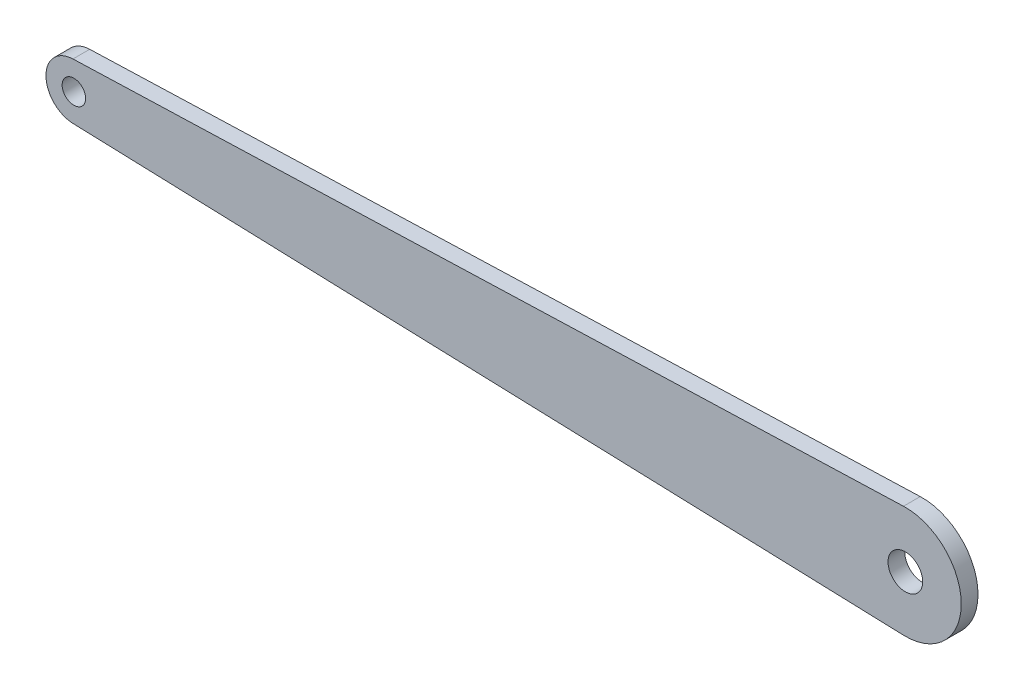
ISO-10303-21;
HEADER;
FILE_DESCRIPTION(('STEP AP214'),'2;1');
FILE_NAME('part.step','',(''),(''),'','','');
FILE_SCHEMA(('AUTOMOTIVE_DESIGN { 1 0 10303 214 1 1 1 1 }'));
ENDSEC;
DATA;
#1=APPLICATION_CONTEXT('core data for automotive mechanical design processes');
#2=APPLICATION_PROTOCOL_DEFINITION('international standard','automotive_design',2000,#1);
#3=PRODUCT_CONTEXT('',#1,'mechanical');
#4=PRODUCT('Part','Part','',(#3));
#5=PRODUCT_RELATED_PRODUCT_CATEGORY('part','',(#4));
#6=PRODUCT_DEFINITION_FORMATION('','',#4);
#7=PRODUCT_DEFINITION_CONTEXT('part definition',#1,'design');
#8=PRODUCT_DEFINITION('design','',#6,#7);
#9=PRODUCT_DEFINITION_SHAPE('','',#8);
#10=(LENGTH_UNIT() NAMED_UNIT(*) SI_UNIT(.MILLI.,.METRE.));
#11=(NAMED_UNIT(*) PLANE_ANGLE_UNIT() SI_UNIT($,.RADIAN.));
#12=(NAMED_UNIT(*) SI_UNIT($,.STERADIAN.) SOLID_ANGLE_UNIT());
#13=UNCERTAINTY_MEASURE_WITH_UNIT(LENGTH_MEASURE(1.E-05),#10,'distance_accuracy_value','');
#14=(GEOMETRIC_REPRESENTATION_CONTEXT(3) GLOBAL_UNCERTAINTY_ASSIGNED_CONTEXT((#13)) GLOBAL_UNIT_ASSIGNED_CONTEXT((#10,
#11,#12)) REPRESENTATION_CONTEXT('',''));
#15=CARTESIAN_POINT('',(0.,0.,0.));
#16=DIRECTION('',(0.,0.,1.));
#17=DIRECTION('',(1.,0.,0.));
#18=AXIS2_PLACEMENT_3D('',#15,#16,#17);
#19=CARTESIAN_POINT('',(-231.057682163255,117.796222956078,-62.1117165948132));
#20=DIRECTION('',(0.,0.,-1.));
#21=DIRECTION('',(-1.,0.,0.));
#22=AXIS2_PLACEMENT_3D('',#19,#20,#21);
#23=PLANE('',#22);
#24=CARTESIAN_POINT('',(-82.2376821632552,117.796222956078,-62.1117165948132));
#25=DIRECTION('',(0.,0.,-1.));
#26=DIRECTION('',(-1.,0.,0.));
#27=AXIS2_PLACEMENT_3D('',#24,#25,#26);
#28=CIRCLE('',#27,3.1);
#29=CARTESIAN_POINT('',(-85.3376821632552,117.796222956078,-62.1117165948132));
#30=VERTEX_POINT('',#29);
#31=EDGE_CURVE('E108',#30,#30,#28,.T.);
#32=ORIENTED_EDGE('',*,*,#31,.F.);
#33=EDGE_LOOP('',(#32));
#34=FACE_BOUND('',#33,.T.);
#35=CARTESIAN_POINT('',(-231.057682163255,117.796222956078,-62.1117165948132));
#36=DIRECTION('',(0.,0.,-1.));
#37=DIRECTION('',(-1.,0.,0.));
#38=AXIS2_PLACEMENT_3D('',#35,#36,#37);
#39=CIRCLE('',#38,5.00000000000001);
#40=CARTESIAN_POINT('',(-231.225670336888,112.799045755546,-62.1117165948132));
#41=VERTEX_POINT('',#40);
#42=CARTESIAN_POINT('',(-231.225670336888,122.793400156611,-62.1117165948132));
#43=VERTEX_POINT('',#42);
#44=EDGE_CURVE('E93',#41,#43,#39,.T.);
#45=ORIENTED_EDGE('',*,*,#44,.T.);
#46=DIRECTION('',(0.999435440106455,0.0335976347265153,0.));
#47=VECTOR('',#46,1.);
#48=CARTESIAN_POINT('',(-231.225670336888,122.793400156611,-62.1117165948132));
#49=LINE('',#48,#47);
#50=CARTESIAN_POINT('',(-82.5736585105203,127.790577357143,-62.1117165948132));
#51=VERTEX_POINT('',#50);
#52=EDGE_CURVE('E88',#43,#51,#49,.T.);
#53=ORIENTED_EDGE('',*,*,#52,.T.);
#54=CARTESIAN_POINT('',(-82.2376821632552,117.796222956078,-62.1117165948132));
#55=DIRECTION('',(0.,0.,-1.));
#56=DIRECTION('',(-1.,0.,0.));
#57=AXIS2_PLACEMENT_3D('',#54,#55,#56);
#58=CIRCLE('',#57,10.);
#59=CARTESIAN_POINT('',(-82.5736585105203,107.801868555014,-62.1117165948132));
#60=VERTEX_POINT('',#59);
#61=EDGE_CURVE('E91',#51,#60,#58,.T.);
#62=ORIENTED_EDGE('',*,*,#61,.T.);
#63=DIRECTION('',(-0.999435440106455,0.0335976347265153,0.));
#64=VECTOR('',#63,1.);
#65=CARTESIAN_POINT('',(-82.5736585105203,107.801868555014,-62.1117165948132));
#66=LINE('',#65,#64);
#67=EDGE_CURVE('E58',#60,#41,#66,.T.);
#68=ORIENTED_EDGE('',*,*,#67,.T.);
#69=EDGE_LOOP('',(#45,#53,#62,#68));
#70=FACE_BOUND('',#69,.T.);
#71=CARTESIAN_POINT('',(-231.057682163255,117.796222956078,-62.1117165948132));
#72=DIRECTION('',(0.,0.,-1.));
#73=DIRECTION('',(-1.,0.,0.));
#74=AXIS2_PLACEMENT_3D('',#71,#72,#73);
#75=CIRCLE('',#74,2.09999999999999);
#76=CARTESIAN_POINT('',(-233.157682163255,117.796222956078,-62.1117165948132));
#77=VERTEX_POINT('',#76);
#78=EDGE_CURVE('E123',#77,#77,#75,.T.);
#79=ORIENTED_EDGE('',*,*,#78,.F.);
#80=EDGE_LOOP('',(#79));
#81=FACE_BOUND('',#80,.T.);
#82=ADVANCED_FACE('F41',(#34,#70,#81),#23,.T.);
#83=CARTESIAN_POINT('',(-231.057682163255,117.796222956078,-59.1117165948132));
#84=DIRECTION('',(0.,0.,-1.));
#85=DIRECTION('',(-1.,0.,0.));
#86=AXIS2_PLACEMENT_3D('',#83,#84,#85);
#87=PLANE('',#86);
#88=CARTESIAN_POINT('',(-231.057682163255,117.796222956078,-59.1117165948132));
#89=DIRECTION('',(0.,0.,-1.));
#90=DIRECTION('',(-1.,0.,0.));
#91=AXIS2_PLACEMENT_3D('',#88,#89,#90);
#92=CIRCLE('',#91,5.00000000000001);
#93=CARTESIAN_POINT('',(-231.225670336888,112.799045755546,-59.1117165948132));
#94=VERTEX_POINT('',#93);
#95=CARTESIAN_POINT('',(-231.225670336888,122.793400156611,-59.1117165948132));
#96=VERTEX_POINT('',#95);
#97=EDGE_CURVE('E105',#94,#96,#92,.T.);
#98=ORIENTED_EDGE('',*,*,#97,.F.);
#99=DIRECTION('',(-0.999435440106455,0.0335976347265153,0.));
#100=VECTOR('',#99,1.);
#101=CARTESIAN_POINT('',(-82.5736585105203,107.801868555014,-59.1117165948132));
#102=LINE('',#101,#100);
#103=CARTESIAN_POINT('',(-82.5736585105203,107.801868555014,-59.1117165948132));
#104=VERTEX_POINT('',#103);
#105=EDGE_CURVE('E81',#104,#94,#102,.T.);
#106=ORIENTED_EDGE('',*,*,#105,.F.);
#107=CARTESIAN_POINT('',(-82.2376821632552,117.796222956078,-59.1117165948132));
#108=DIRECTION('',(0.,0.,-1.));
#109=DIRECTION('',(-1.,0.,0.));
#110=AXIS2_PLACEMENT_3D('',#107,#108,#109);
#111=CIRCLE('',#110,10.);
#112=CARTESIAN_POINT('',(-82.5736585105203,127.790577357143,-59.1117165948132));
#113=VERTEX_POINT('',#112);
#114=EDGE_CURVE('E75',#113,#104,#111,.T.);
#115=ORIENTED_EDGE('',*,*,#114,.F.);
#116=DIRECTION('',(0.999435440106455,0.0335976347265153,0.));
#117=VECTOR('',#116,1.);
#118=CARTESIAN_POINT('',(-231.225670336888,122.793400156611,-59.1117165948132));
#119=LINE('',#118,#117);
#120=EDGE_CURVE('E97',#96,#113,#119,.T.);
#121=ORIENTED_EDGE('',*,*,#120,.F.);
#122=EDGE_LOOP('',(#98,#106,#115,#121));
#123=FACE_BOUND('',#122,.T.);
#124=CARTESIAN_POINT('',(-82.2376821632552,117.796222956078,-59.1117165948132));
#125=DIRECTION('',(0.,0.,-1.));
#126=DIRECTION('',(-1.,0.,0.));
#127=AXIS2_PLACEMENT_3D('',#124,#125,#126);
#128=CIRCLE('',#127,3.1);
#129=CARTESIAN_POINT('',(-85.3376821632552,117.796222956078,-59.1117165948132));
#130=VERTEX_POINT('',#129);
#131=EDGE_CURVE('E120',#130,#130,#128,.T.);
#132=ORIENTED_EDGE('',*,*,#131,.T.);
#133=EDGE_LOOP('',(#132));
#134=FACE_BOUND('',#133,.T.);
#135=CARTESIAN_POINT('',(-231.057682163255,117.796222956078,-59.1117165948132));
#136=DIRECTION('',(0.,0.,-1.));
#137=DIRECTION('',(-1.,0.,0.));
#138=AXIS2_PLACEMENT_3D('',#135,#136,#137);
#139=CIRCLE('',#138,2.09999999999999);
#140=CARTESIAN_POINT('',(-233.157682163255,117.796222956078,-59.1117165948132));
#141=VERTEX_POINT('',#140);
#142=EDGE_CURVE('E126',#141,#141,#139,.T.);
#143=ORIENTED_EDGE('',*,*,#142,.T.);
#144=EDGE_LOOP('',(#143));
#145=FACE_BOUND('',#144,.T.);
#146=ADVANCED_FACE('F116',(#123,#134,#145),#87,.F.);
#147=CARTESIAN_POINT('',(-231.057682163255,117.796222956078,-62.1117165948132));
#148=DIRECTION('',(0.,0.,1.));
#149=DIRECTION('',(1.,0.,0.));
#150=AXIS2_PLACEMENT_3D('',#147,#148,#149);
#151=CYLINDRICAL_SURFACE('',#150,5.00000000000001);
#152=ORIENTED_EDGE('',*,*,#97,.T.);
#153=DIRECTION('',(0.,0.,1.));
#154=VECTOR('',#153,1.);
#155=CARTESIAN_POINT('',(-231.225670336888,122.793400156611,-62.1117165948132));
#156=LINE('',#155,#154);
#157=EDGE_CURVE('E11',#43,#96,#156,.T.);
#158=ORIENTED_EDGE('',*,*,#157,.F.);
#159=ORIENTED_EDGE('',*,*,#44,.F.);
#160=DIRECTION('',(0.,0.,1.));
#161=VECTOR('',#160,1.);
#162=CARTESIAN_POINT('',(-231.225670336888,112.799045755546,-62.1117165948132));
#163=LINE('',#162,#161);
#164=EDGE_CURVE('E101',#41,#94,#163,.T.);
#165=ORIENTED_EDGE('',*,*,#164,.T.);
#166=EDGE_LOOP('',(#152,#158,#159,#165));
#167=FACE_BOUND('',#166,.T.);
#168=ADVANCED_FACE('F43',(#167),#151,.T.);
#169=CARTESIAN_POINT('',(-231.225670336888,122.793400156611,-62.1117165948132));
#170=DIRECTION('',(0.0335976347265153,-0.999435440106455,0.));
#171=DIRECTION('',(0.999435440106455,0.0335976347265153,0.));
#172=AXIS2_PLACEMENT_3D('',#169,#170,#171);
#173=PLANE('',#172);
#174=ORIENTED_EDGE('',*,*,#120,.T.);
#175=DIRECTION('',(0.,0.,1.));
#176=VECTOR('',#175,1.);
#177=CARTESIAN_POINT('',(-82.5736585105203,127.790577357143,-62.1117165948132));
#178=LINE('',#177,#176);
#179=EDGE_CURVE('E50',#51,#113,#178,.T.);
#180=ORIENTED_EDGE('',*,*,#179,.F.);
#181=ORIENTED_EDGE('',*,*,#52,.F.);
#182=ORIENTED_EDGE('',*,*,#157,.T.);
#183=EDGE_LOOP('',(#174,#180,#181,#182));
#184=FACE_BOUND('',#183,.T.);
#185=ADVANCED_FACE('F96',(#184),#173,.F.);
#186=CARTESIAN_POINT('',(-82.2376821632552,117.796222956078,-62.1117165948132));
#187=DIRECTION('',(0.,0.,1.));
#188=DIRECTION('',(1.,0.,0.));
#189=AXIS2_PLACEMENT_3D('',#186,#187,#188);
#190=CYLINDRICAL_SURFACE('',#189,10.);
#191=ORIENTED_EDGE('',*,*,#114,.T.);
#192=DIRECTION('',(0.,0.,1.));
#193=VECTOR('',#192,1.);
#194=CARTESIAN_POINT('',(-82.5736585105203,107.801868555014,-62.1117165948132));
#195=LINE('',#194,#193);
#196=EDGE_CURVE('E98',#60,#104,#195,.T.);
#197=ORIENTED_EDGE('',*,*,#196,.F.);
#198=ORIENTED_EDGE('',*,*,#61,.F.);
#199=ORIENTED_EDGE('',*,*,#179,.T.);
#200=EDGE_LOOP('',(#191,#197,#198,#199));
#201=FACE_BOUND('',#200,.T.);
#202=ADVANCED_FACE('F99',(#201),#190,.T.);
#203=CARTESIAN_POINT('',(-82.5736585105203,107.801868555014,-62.1117165948132));
#204=DIRECTION('',(0.0335976347265153,0.999435440106455,0.));
#205=DIRECTION('',(-0.999435440106455,0.0335976347265153,0.));
#206=AXIS2_PLACEMENT_3D('',#203,#204,#205);
#207=PLANE('',#206);
#208=ORIENTED_EDGE('',*,*,#105,.T.);
#209=ORIENTED_EDGE('',*,*,#164,.F.);
#210=ORIENTED_EDGE('',*,*,#67,.F.);
#211=ORIENTED_EDGE('',*,*,#196,.T.);
#212=EDGE_LOOP('',(#208,#209,#210,#211));
#213=FACE_BOUND('',#212,.T.);
#214=ADVANCED_FACE('F113',(#213),#207,.F.);
#215=CARTESIAN_POINT('',(-82.2376821632552,117.796222956078,-62.1117165948132));
#216=DIRECTION('',(0.,0.,1.));
#217=DIRECTION('',(1.,0.,0.));
#218=AXIS2_PLACEMENT_3D('',#215,#216,#217);
#219=CYLINDRICAL_SURFACE('',#218,3.1);
#220=ORIENTED_EDGE('',*,*,#31,.T.);
#221=EDGE_LOOP('',(#220));
#222=FACE_BOUND('',#221,.T.);
#223=ORIENTED_EDGE('',*,*,#131,.F.);
#224=EDGE_LOOP('',(#223));
#225=FACE_BOUND('',#224,.T.);
#226=ADVANCED_FACE('F143',(#222,#225),#219,.F.);
#227=CARTESIAN_POINT('',(-231.057682163255,117.796222956078,-62.1117165948132));
#228=DIRECTION('',(0.,0.,1.));
#229=DIRECTION('',(1.,0.,0.));
#230=AXIS2_PLACEMENT_3D('',#227,#228,#229);
#231=CYLINDRICAL_SURFACE('',#230,2.09999999999999);
#232=ORIENTED_EDGE('',*,*,#78,.T.);
#233=EDGE_LOOP('',(#232));
#234=FACE_BOUND('',#233,.T.);
#235=ORIENTED_EDGE('',*,*,#142,.F.);
#236=EDGE_LOOP('',(#235));
#237=FACE_BOUND('',#236,.T.);
#238=ADVANCED_FACE('F132',(#234,#237),#231,.F.);
#239=CLOSED_SHELL('',(#82,#146,#168,#185,#202,#214,#226,#238));
#240=MANIFOLD_SOLID_BREP('B2',#239);
#241=ADVANCED_BREP_SHAPE_REPRESENTATION('',(#18,#240),#14);
#242=SHAPE_DEFINITION_REPRESENTATION(#9,#241);
ENDSEC;
END-ISO-10303-21;
